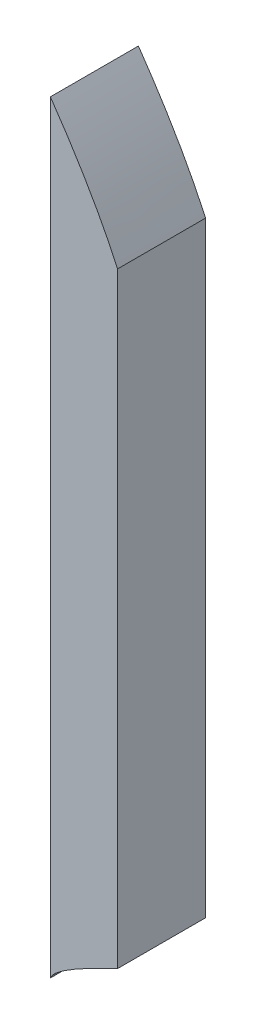
ISO-10303-21;
HEADER;
FILE_DESCRIPTION(('STEP AP214'),'2;1');
FILE_NAME('part.step','',(''),(''),'','','');
FILE_SCHEMA(('AUTOMOTIVE_DESIGN { 1 0 10303 214 1 1 1 1 }'));
ENDSEC;
DATA;
#1=APPLICATION_CONTEXT('core data for automotive mechanical design processes');
#2=APPLICATION_PROTOCOL_DEFINITION('international standard','automotive_design',2000,#1);
#3=PRODUCT_CONTEXT('',#1,'mechanical');
#4=PRODUCT('Part','Part','',(#3));
#5=PRODUCT_RELATED_PRODUCT_CATEGORY('part','',(#4));
#6=PRODUCT_DEFINITION_FORMATION('','',#4);
#7=PRODUCT_DEFINITION_CONTEXT('part definition',#1,'design');
#8=PRODUCT_DEFINITION('design','',#6,#7);
#9=PRODUCT_DEFINITION_SHAPE('','',#8);
#10=(LENGTH_UNIT() NAMED_UNIT(*) SI_UNIT(.MILLI.,.METRE.));
#11=(NAMED_UNIT(*) PLANE_ANGLE_UNIT() SI_UNIT($,.RADIAN.));
#12=(NAMED_UNIT(*) SI_UNIT($,.STERADIAN.) SOLID_ANGLE_UNIT());
#13=UNCERTAINTY_MEASURE_WITH_UNIT(LENGTH_MEASURE(1.E-05),#10,'distance_accuracy_value','');
#14=(GEOMETRIC_REPRESENTATION_CONTEXT(3) GLOBAL_UNCERTAINTY_ASSIGNED_CONTEXT((#13)) GLOBAL_UNIT_ASSIGNED_CONTEXT((#10,
#11,#12)) REPRESENTATION_CONTEXT('',''));
#15=CARTESIAN_POINT('',(0.,0.,0.));
#16=DIRECTION('',(0.,0.,1.));
#17=DIRECTION('',(1.,0.,0.));
#18=AXIS2_PLACEMENT_3D('',#15,#16,#17);
#19=CARTESIAN_POINT('',(-75.9903262226958,-123.436639643613,35.9999999999997));
#20=CARTESIAN_POINT('',(-75.9681634348196,-123.36293243839,35.9999999999997));
#21=CARTESIAN_POINT('',(-75.930054879544,-123.294895182174,35.9999999999997));
#22=CARTESIAN_POINT('',(-75.8439039954912,-123.167840461941,35.9999999999997));
#23=CARTESIAN_POINT('',(-75.7952147073782,-123.107742993571,35.9999999999997));
#24=CARTESIAN_POINT('',(-75.6427775723728,-122.937622524929,35.9999999999997));
#25=CARTESIAN_POINT('',(-75.5303493579106,-122.836357033047,35.9999999999997));
#26=CARTESIAN_POINT('',(-75.1813674440414,-122.545713775985,35.9999999999997));
#27=CARTESIAN_POINT('',(-74.9349299527771,-122.365972226559,35.9999999999997));
#28=CARTESIAN_POINT('',(-74.1779306723573,-121.862934920066,35.9999999999997));
#29=CARTESIAN_POINT('',(-73.6548893974203,-121.560473253277,35.9999999999997));
#30=CARTESIAN_POINT('',(-72.5935887934581,-120.98279448516,35.9999999999997));
#31=CARTESIAN_POINT('',(-72.0548910939345,-120.708362189411,35.9999999999997));
#32=CARTESIAN_POINT('',(-70.9718958880678,-120.169522815497,35.9999999999997));
#33=CARTESIAN_POINT('',(-70.427300022688,-119.905807445364,35.9999999999997));
#34=CARTESIAN_POINT('',(-69.8827442780941,-119.642260198755,35.9999999999997));
#35=B_SPLINE_CURVE_WITH_KNOTS('',3,(#19,#20,#21,#22,#23,#24,#25,#26,#27,#28,#29,#30,#31,#32,#33,
#34),.UNSPECIFIED.,.F.,.F.,(4,2,2,2,2,2,2,4),(0.,0.0312499999999963,0.0624999999999926,
0.124999999999989,0.249999999999988,0.499999999999992,0.749999999999996,1.),.UNSPECIFIED.);
#36=DIRECTION('',(0.,0.,1.));
#37=VECTOR('',#36,1.);
#38=SURFACE_OF_LINEAR_EXTRUSION('',#35,#37);
#39=CARTESIAN_POINT('',(-69.8827442780941,-119.642260198755,43.9999999999997));
#40=CARTESIAN_POINT('',(-70.427300022688,-119.905807445364,43.9999999999997));
#41=CARTESIAN_POINT('',(-70.9718958880678,-120.169522815497,43.9999999999997));
#42=CARTESIAN_POINT('',(-72.0548910939345,-120.708362189411,43.9999999999997));
#43=CARTESIAN_POINT('',(-72.5935887934581,-120.98279448516,43.9999999999997));
#44=CARTESIAN_POINT('',(-73.6548893974203,-121.560473253277,43.9999999999997));
#45=CARTESIAN_POINT('',(-74.1779306723573,-121.862934920066,43.9999999999997));
#46=CARTESIAN_POINT('',(-74.9349299527771,-122.365972226559,43.9999999999997));
#47=CARTESIAN_POINT('',(-75.1813674440414,-122.545713775985,43.9999999999997));
#48=CARTESIAN_POINT('',(-75.5303493579106,-122.836357033047,43.9999999999997));
#49=CARTESIAN_POINT('',(-75.6427775723728,-122.937622524929,43.9999999999997));
#50=CARTESIAN_POINT('',(-75.7952147073782,-123.107742993571,43.9999999999997));
#51=CARTESIAN_POINT('',(-75.8439039954912,-123.167840461941,43.9999999999997));
#52=CARTESIAN_POINT('',(-75.930054879544,-123.294895182174,43.9999999999997));
#53=CARTESIAN_POINT('',(-75.9681634348196,-123.36293243839,43.9999999999997));
#54=CARTESIAN_POINT('',(-75.9903262226958,-123.436639643613,43.9999999999997));
#55=B_SPLINE_CURVE_WITH_KNOTS('',3,(#39,#40,#41,#42,#43,#44,#45,#46,#47,#48,#49,#50,#51,#52,#53,
#54),.UNSPECIFIED.,.F.,.F.,(4,2,2,2,2,2,2,4),(0.,0.250000000000004,0.500000000000008,
0.750000000000012,0.875000000000011,0.937500000000007,0.968750000000004,1.),.UNSPECIFIED.);
#56=CARTESIAN_POINT('',(-75.9903262226958,-123.436639643613,43.9999999999997));
#57=VERTEX_POINT('',#56);
#58=CARTESIAN_POINT('',(-69.8827442780941,-119.642260198755,43.9999999999997));
#59=VERTEX_POINT('',#58);
#60=EDGE_CURVE('E143',#57,#59,#55,.F.);
#61=ORIENTED_EDGE('',*,*,#60,.F.);
#62=DIRECTION('',(0.,0.,1.));
#63=VECTOR('',#62,1.);
#64=CARTESIAN_POINT('',(-75.9903262226958,-123.436639643613,35.9999999999997));
#65=LINE('',#64,#63);
#66=CARTESIAN_POINT('',(-75.9903262226958,-123.436639643613,35.9999999999997));
#67=VERTEX_POINT('',#66);
#68=EDGE_CURVE('E11',#67,#57,#65,.T.);
#69=ORIENTED_EDGE('',*,*,#68,.F.);
#70=CARTESIAN_POINT('',(-75.9903262226958,-123.436639643613,35.9999999999997));
#71=CARTESIAN_POINT('',(-75.9681634348196,-123.36293243839,35.9999999999997));
#72=CARTESIAN_POINT('',(-75.930054879544,-123.294895182174,35.9999999999997));
#73=CARTESIAN_POINT('',(-75.8439039954912,-123.167840461941,35.9999999999997));
#74=CARTESIAN_POINT('',(-75.7952147073782,-123.107742993571,35.9999999999997));
#75=CARTESIAN_POINT('',(-75.6427775723728,-122.937622524929,35.9999999999997));
#76=CARTESIAN_POINT('',(-75.5303493579106,-122.836357033047,35.9999999999997));
#77=CARTESIAN_POINT('',(-75.1813674440414,-122.545713775985,35.9999999999997));
#78=CARTESIAN_POINT('',(-74.9349299527771,-122.365972226559,35.9999999999997));
#79=CARTESIAN_POINT('',(-74.1779306723573,-121.862934920066,35.9999999999997));
#80=CARTESIAN_POINT('',(-73.6548893974203,-121.560473253277,35.9999999999997));
#81=CARTESIAN_POINT('',(-72.5935887934581,-120.98279448516,35.9999999999997));
#82=CARTESIAN_POINT('',(-72.0548910939345,-120.708362189411,35.9999999999997));
#83=CARTESIAN_POINT('',(-70.9718958880678,-120.169522815497,35.9999999999997));
#84=CARTESIAN_POINT('',(-70.427300022688,-119.905807445364,35.9999999999997));
#85=CARTESIAN_POINT('',(-69.8827442780941,-119.642260198755,35.9999999999997));
#86=B_SPLINE_CURVE_WITH_KNOTS('',3,(#70,#71,#72,#73,#74,#75,#76,#77,#78,#79,#80,#81,#82,#83,#84,
#85),.UNSPECIFIED.,.F.,.F.,(4,2,2,2,2,2,2,4),(0.,0.0312499999999963,0.0624999999999926,
0.124999999999989,0.249999999999988,0.499999999999992,0.749999999999996,1.),.UNSPECIFIED.);
#87=CARTESIAN_POINT('',(-69.8827442780941,-119.642260198755,35.9999999999997));
#88=VERTEX_POINT('',#87);
#89=EDGE_CURVE('E97',#67,#88,#86,.T.);
#90=ORIENTED_EDGE('',*,*,#89,.T.);
#91=DIRECTION('',(0.,0.,1.));
#92=VECTOR('',#91,1.);
#93=CARTESIAN_POINT('',(-69.8827442780941,-119.642260198755,35.9999999999997));
#94=LINE('',#93,#92);
#95=EDGE_CURVE('E76',#88,#59,#94,.T.);
#96=ORIENTED_EDGE('',*,*,#95,.T.);
#97=EDGE_LOOP('',(#61,#69,#90,#96));
#98=FACE_BOUND('',#97,.T.);
#99=ADVANCED_FACE('F30',(#98),#38,.T.);
#100=CARTESIAN_POINT('',(-75.9902872258598,-54.0826655206619,35.9999999999997));
#101=DIRECTION('',(-0.999999999999842,5.62286970024419E-07,0.));
#102=DIRECTION('',(-5.62286970024419E-07,-0.999999999999842,0.));
#103=AXIS2_PLACEMENT_3D('',#100,#101,#102);
#104=PLANE('',#103);
#105=DIRECTION('',(-5.62286970024419E-07,-0.999999999999842,0.));
#106=VECTOR('',#105,1.);
#107=CARTESIAN_POINT('',(-75.9902872258598,-54.0826655206619,43.9999999999997));
#108=LINE('',#107,#106);
#109=CARTESIAN_POINT('',(-75.9902872258598,-54.0826655206619,43.9999999999997));
#110=VERTEX_POINT('',#109);
#111=EDGE_CURVE('E99',#110,#57,#108,.T.);
#112=ORIENTED_EDGE('',*,*,#111,.F.);
#113=DIRECTION('',(0.,0.,1.));
#114=VECTOR('',#113,1.);
#115=CARTESIAN_POINT('',(-75.9902872258598,-54.0826655206619,35.9999999999997));
#116=LINE('',#115,#114);
#117=CARTESIAN_POINT('',(-75.9902872258598,-54.0826655206619,35.9999999999997));
#118=VERTEX_POINT('',#117);
#119=EDGE_CURVE('E42',#118,#110,#116,.T.);
#120=ORIENTED_EDGE('',*,*,#119,.F.);
#121=DIRECTION('',(-5.62286970024419E-07,-0.999999999999842,0.));
#122=VECTOR('',#121,1.);
#123=CARTESIAN_POINT('',(-75.9902872258598,-54.0826655206619,35.9999999999997));
#124=LINE('',#123,#122);
#125=EDGE_CURVE('E93',#118,#67,#124,.T.);
#126=ORIENTED_EDGE('',*,*,#125,.T.);
#127=ORIENTED_EDGE('',*,*,#68,.T.);
#128=EDGE_LOOP('',(#112,#120,#126,#127));
#129=FACE_BOUND('',#128,.T.);
#130=ADVANCED_FACE('F129',(#129),#104,.T.);
#131=CARTESIAN_POINT('',(-69.8827442780941,-64.5713829705555,35.9999999999997));
#132=CARTESIAN_POINT('',(-70.723512563911,-62.7353135218002,35.9999999999997));
#133=CARTESIAN_POINT('',(-71.668725225975,-60.9505070073036,35.9999999999997));
#134=CARTESIAN_POINT('',(-73.2061469362624,-58.3320001207578,35.9999999999997));
#135=CARTESIAN_POINT('',(-73.7387166206833,-57.4690278156885,35.9999999999997));
#136=CARTESIAN_POINT('',(-74.8398699199215,-55.7607594061521,35.9999999999997));
#137=CARTESIAN_POINT('',(-75.4089942324416,-54.9148273106867,35.9999999999997));
#138=CARTESIAN_POINT('',(-75.9902872258598,-54.0826655206619,35.9999999999997));
#139=B_SPLINE_CURVE_WITH_KNOTS('',3,(#131,#132,#133,#134,#135,#136,#137,#138),.UNSPECIFIED.,.F.,
.F.,(4,2,2,4),(0.,0.499999999999999,0.75,1.),.UNSPECIFIED.);
#140=DIRECTION('',(0.,0.,1.));
#141=VECTOR('',#140,1.);
#142=SURFACE_OF_LINEAR_EXTRUSION('',#139,#141);
#143=CARTESIAN_POINT('',(-75.9902872258598,-54.0826655206619,43.9999999999997));
#144=CARTESIAN_POINT('',(-75.4089942324416,-54.9148273106867,43.9999999999997));
#145=CARTESIAN_POINT('',(-74.8398699199215,-55.7607594061521,43.9999999999997));
#146=CARTESIAN_POINT('',(-73.7387166206833,-57.4690278156885,43.9999999999997));
#147=CARTESIAN_POINT('',(-73.2061469362624,-58.3320001207578,43.9999999999997));
#148=CARTESIAN_POINT('',(-71.668725225975,-60.9505070073036,43.9999999999997));
#149=CARTESIAN_POINT('',(-70.723512563911,-62.7353135218002,43.9999999999997));
#150=CARTESIAN_POINT('',(-69.8827442780941,-64.5713829705555,43.9999999999997));
#151=B_SPLINE_CURVE_WITH_KNOTS('',3,(#143,#144,#145,#146,#147,#148,#149,#150),.UNSPECIFIED.,.F.,
.F.,(4,2,2,4),(0.,0.25,0.500000000000001,1.),.UNSPECIFIED.);
#152=CARTESIAN_POINT('',(-69.8827442780941,-64.5713829705555,43.9999999999997));
#153=VERTEX_POINT('',#152);
#154=EDGE_CURVE('E85',#153,#110,#151,.F.);
#155=ORIENTED_EDGE('',*,*,#154,.F.);
#156=DIRECTION('',(0.,0.,1.));
#157=VECTOR('',#156,1.);
#158=CARTESIAN_POINT('',(-69.8827442780941,-64.5713829705555,35.9999999999997));
#159=LINE('',#158,#157);
#160=CARTESIAN_POINT('',(-69.8827442780941,-64.5713829705555,35.9999999999997));
#161=VERTEX_POINT('',#160);
#162=EDGE_CURVE('E79',#161,#153,#159,.T.);
#163=ORIENTED_EDGE('',*,*,#162,.F.);
#164=CARTESIAN_POINT('',(-69.8827442780941,-64.5713829705555,35.9999999999997));
#165=CARTESIAN_POINT('',(-70.723512563911,-62.7353135218002,35.9999999999997));
#166=CARTESIAN_POINT('',(-71.668725225975,-60.9505070073036,35.9999999999997));
#167=CARTESIAN_POINT('',(-73.2061469362624,-58.3320001207578,35.9999999999997));
#168=CARTESIAN_POINT('',(-73.7387166206833,-57.4690278156885,35.9999999999997));
#169=CARTESIAN_POINT('',(-74.8398699199215,-55.7607594061521,35.9999999999997));
#170=CARTESIAN_POINT('',(-75.4089942324416,-54.9148273106867,35.9999999999997));
#171=CARTESIAN_POINT('',(-75.9902872258598,-54.0826655206619,35.9999999999997));
#172=B_SPLINE_CURVE_WITH_KNOTS('',3,(#164,#165,#166,#167,#168,#169,#170,#171),.UNSPECIFIED.,.F.,
.F.,(4,2,2,4),(0.,0.499999999999999,0.75,1.),.UNSPECIFIED.);
#173=EDGE_CURVE('E82',#161,#118,#172,.T.);
#174=ORIENTED_EDGE('',*,*,#173,.T.);
#175=ORIENTED_EDGE('',*,*,#119,.T.);
#176=EDGE_LOOP('',(#155,#163,#174,#175));
#177=FACE_BOUND('',#176,.T.);
#178=ADVANCED_FACE('F81',(#177),#142,.T.);
#179=CARTESIAN_POINT('',(-69.8827442780941,-119.642260198755,35.9999999999997));
#180=DIRECTION('',(1.,0.,0.));
#181=DIRECTION('',(0.,1.,0.));
#182=AXIS2_PLACEMENT_3D('',#179,#180,#181);
#183=PLANE('',#182);
#184=DIRECTION('',(0.,1.,0.));
#185=VECTOR('',#184,1.);
#186=CARTESIAN_POINT('',(-69.8827442780941,-119.642260198755,43.9999999999997));
#187=LINE('',#186,#185);
#188=EDGE_CURVE('E144',#59,#153,#187,.T.);
#189=ORIENTED_EDGE('',*,*,#188,.F.);
#190=ORIENTED_EDGE('',*,*,#95,.F.);
#191=DIRECTION('',(0.,1.,0.));
#192=VECTOR('',#191,1.);
#193=CARTESIAN_POINT('',(-69.8827442780941,-119.642260198755,35.9999999999997));
#194=LINE('',#193,#192);
#195=EDGE_CURVE('E92',#88,#161,#194,.T.);
#196=ORIENTED_EDGE('',*,*,#195,.T.);
#197=ORIENTED_EDGE('',*,*,#162,.T.);
#198=EDGE_LOOP('',(#189,#190,#196,#197));
#199=FACE_BOUND('',#198,.T.);
#200=ADVANCED_FACE('F96',(#199),#183,.T.);
#201=CARTESIAN_POINT('',(-73.1242390954392,-121.271633869219,35.9999999999997));
#202=DIRECTION('',(0.,0.,1.));
#203=DIRECTION('',(1.,0.,0.));
#204=AXIS2_PLACEMENT_3D('',#201,#202,#203);
#205=PLANE('',#204);
#206=ORIENTED_EDGE('',*,*,#89,.F.);
#207=ORIENTED_EDGE('',*,*,#125,.F.);
#208=ORIENTED_EDGE('',*,*,#173,.F.);
#209=ORIENTED_EDGE('',*,*,#195,.F.);
#210=EDGE_LOOP('',(#206,#207,#208,#209));
#211=FACE_BOUND('',#210,.T.);
#212=ADVANCED_FACE('F91',(#211),#205,.F.);
#213=CARTESIAN_POINT('',(-73.1242390954392,-121.271633869219,43.9999999999997));
#214=DIRECTION('',(0.,0.,1.));
#215=DIRECTION('',(1.,0.,0.));
#216=AXIS2_PLACEMENT_3D('',#213,#214,#215);
#217=PLANE('',#216);
#218=ORIENTED_EDGE('',*,*,#60,.T.);
#219=ORIENTED_EDGE('',*,*,#188,.T.);
#220=ORIENTED_EDGE('',*,*,#154,.T.);
#221=ORIENTED_EDGE('',*,*,#111,.T.);
#222=EDGE_LOOP('',(#218,#219,#220,#221));
#223=FACE_BOUND('',#222,.T.);
#224=ADVANCED_FACE('F118',(#223),#217,.T.);
#225=CLOSED_SHELL('',(#99,#130,#178,#200,#212,#224));
#226=MANIFOLD_SOLID_BREP('B2',#225);
#227=ADVANCED_BREP_SHAPE_REPRESENTATION('',(#18,#226),#14);
#228=SHAPE_DEFINITION_REPRESENTATION(#9,#227);
ENDSEC;
END-ISO-10303-21;
